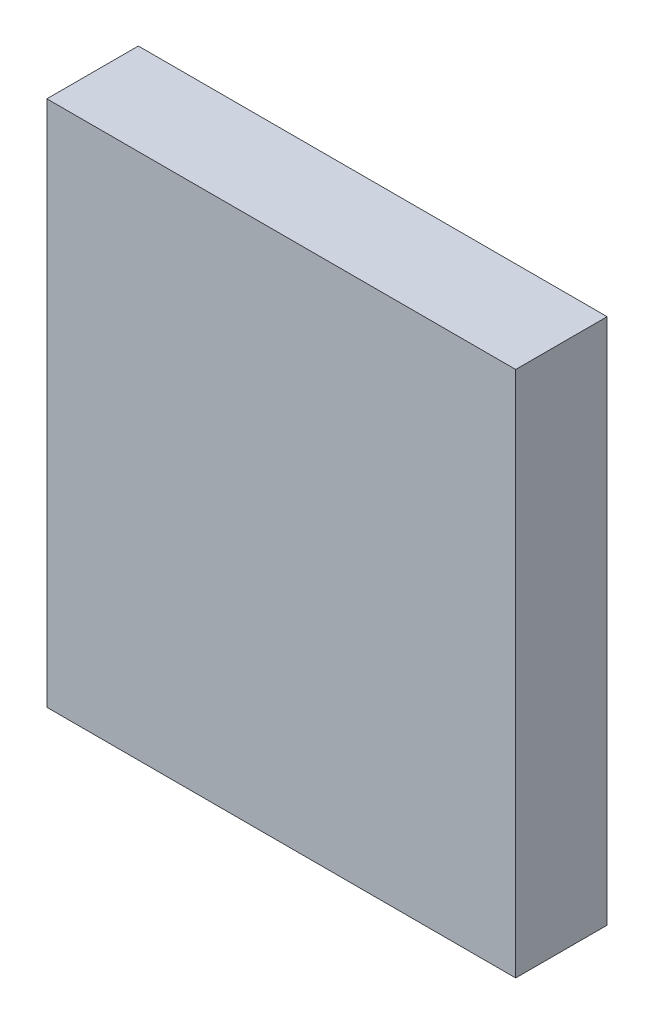
ISO-10303-21;
HEADER;
FILE_DESCRIPTION(('STEP AP214'),'2;1');
FILE_NAME('part.step','',(''),(''),'','','');
FILE_SCHEMA(('AUTOMOTIVE_DESIGN { 1 0 10303 214 1 1 1 1 }'));
ENDSEC;
DATA;
#1=APPLICATION_CONTEXT('core data for automotive mechanical design processes');
#2=APPLICATION_PROTOCOL_DEFINITION('international standard','automotive_design',2000,#1);
#3=PRODUCT_CONTEXT('',#1,'mechanical');
#4=PRODUCT('Part','Part','',(#3));
#5=PRODUCT_RELATED_PRODUCT_CATEGORY('part','',(#4));
#6=PRODUCT_DEFINITION_FORMATION('','',#4);
#7=PRODUCT_DEFINITION_CONTEXT('part definition',#1,'design');
#8=PRODUCT_DEFINITION('design','',#6,#7);
#9=PRODUCT_DEFINITION_SHAPE('','',#8);
#10=(LENGTH_UNIT() NAMED_UNIT(*) SI_UNIT(.MILLI.,.METRE.));
#11=(NAMED_UNIT(*) PLANE_ANGLE_UNIT() SI_UNIT($,.RADIAN.));
#12=(NAMED_UNIT(*) SI_UNIT($,.STERADIAN.) SOLID_ANGLE_UNIT());
#13=UNCERTAINTY_MEASURE_WITH_UNIT(LENGTH_MEASURE(1.E-05),#10,'distance_accuracy_value','');
#14=(GEOMETRIC_REPRESENTATION_CONTEXT(3) GLOBAL_UNCERTAINTY_ASSIGNED_CONTEXT((#13)) GLOBAL_UNIT_ASSIGNED_CONTEXT((#10,
#11,#12)) REPRESENTATION_CONTEXT('',''));
#15=CARTESIAN_POINT('',(0.,0.,0.));
#16=DIRECTION('',(0.,0.,1.));
#17=DIRECTION('',(1.,0.,0.));
#18=AXIS2_PLACEMENT_3D('',#15,#16,#17);
#19=CARTESIAN_POINT('',(-2.5635,-2.5635,1.));
#20=DIRECTION('',(1.,0.,0.));
#21=DIRECTION('',(0.,0.,-1.));
#22=AXIS2_PLACEMENT_3D('',#19,#20,#21);
#23=PLANE('',#22);
#24=DIRECTION('',(0.,-1.,0.));
#25=VECTOR('',#24,1.);
#26=CARTESIAN_POINT('',(-2.5635,-2.5635,0.));
#27=LINE('',#26,#25);
#28=CARTESIAN_POINT('',(-2.5635,3.2,0.));
#29=VERTEX_POINT('',#28);
#30=CARTESIAN_POINT('',(-2.5635,-2.5635,0.));
#31=VERTEX_POINT('',#30);
#32=EDGE_CURVE('E116',#29,#31,#27,.T.);
#33=ORIENTED_EDGE('',*,*,#32,.T.);
#34=DIRECTION('',(0.,0.,-1.));
#35=VECTOR('',#34,1.);
#36=CARTESIAN_POINT('',(-2.5635,-2.5635,1.));
#37=LINE('',#36,#35);
#38=CARTESIAN_POINT('',(-2.5635,-2.5635,1.));
#39=VERTEX_POINT('',#38);
#40=EDGE_CURVE('E11',#39,#31,#37,.T.);
#41=ORIENTED_EDGE('',*,*,#40,.F.);
#42=DIRECTION('',(0.,-1.,0.));
#43=VECTOR('',#42,1.);
#44=CARTESIAN_POINT('',(-2.5635,-2.5635,1.));
#45=LINE('',#44,#43);
#46=CARTESIAN_POINT('',(-2.5635,3.2,1.));
#47=VERTEX_POINT('',#46);
#48=EDGE_CURVE('E98',#47,#39,#45,.T.);
#49=ORIENTED_EDGE('',*,*,#48,.F.);
#50=DIRECTION('',(0.,0.,-1.));
#51=VECTOR('',#50,1.);
#52=CARTESIAN_POINT('',(-2.5635,3.2,1.));
#53=LINE('',#52,#51);
#54=EDGE_CURVE('E112',#47,#29,#53,.T.);
#55=ORIENTED_EDGE('',*,*,#54,.T.);
#56=EDGE_LOOP('',(#33,#41,#49,#55));
#57=FACE_BOUND('',#56,.T.);
#58=ADVANCED_FACE('F38',(#57),#23,.F.);
#59=CARTESIAN_POINT('',(2.5635,-2.5635,1.));
#60=DIRECTION('',(0.,1.,0.));
#61=DIRECTION('',(0.,0.,1.));
#62=AXIS2_PLACEMENT_3D('',#59,#60,#61);
#63=PLANE('',#62);
#64=DIRECTION('',(1.,0.,0.));
#65=VECTOR('',#64,1.);
#66=CARTESIAN_POINT('',(2.5635,-2.5635,0.));
#67=LINE('',#66,#65);
#68=CARTESIAN_POINT('',(2.5635,-2.5635,0.));
#69=VERTEX_POINT('',#68);
#70=EDGE_CURVE('E103',#31,#69,#67,.T.);
#71=ORIENTED_EDGE('',*,*,#70,.T.);
#72=DIRECTION('',(0.,0.,-1.));
#73=VECTOR('',#72,1.);
#74=CARTESIAN_POINT('',(2.5635,-2.5635,1.));
#75=LINE('',#74,#73);
#76=CARTESIAN_POINT('',(2.5635,-2.5635,1.));
#77=VERTEX_POINT('',#76);
#78=EDGE_CURVE('E47',#77,#69,#75,.T.);
#79=ORIENTED_EDGE('',*,*,#78,.F.);
#80=DIRECTION('',(1.,0.,0.));
#81=VECTOR('',#80,1.);
#82=CARTESIAN_POINT('',(2.5635,-2.5635,1.));
#83=LINE('',#82,#81);
#84=EDGE_CURVE('E93',#39,#77,#83,.T.);
#85=ORIENTED_EDGE('',*,*,#84,.F.);
#86=ORIENTED_EDGE('',*,*,#40,.T.);
#87=EDGE_LOOP('',(#71,#79,#85,#86));
#88=FACE_BOUND('',#87,.T.);
#89=ADVANCED_FACE('F102',(#88),#63,.F.);
#90=CARTESIAN_POINT('',(2.5635,3.2,1.));
#91=DIRECTION('',(-1.,0.,0.));
#92=DIRECTION('',(0.,0.,1.));
#93=AXIS2_PLACEMENT_3D('',#90,#91,#92);
#94=PLANE('',#93);
#95=DIRECTION('',(0.,1.,0.));
#96=VECTOR('',#95,1.);
#97=CARTESIAN_POINT('',(2.5635,3.2,0.));
#98=LINE('',#97,#96);
#99=CARTESIAN_POINT('',(2.5635,3.2,0.));
#100=VERTEX_POINT('',#99);
#101=EDGE_CURVE('E79',#69,#100,#98,.T.);
#102=ORIENTED_EDGE('',*,*,#101,.T.);
#103=DIRECTION('',(0.,0.,-1.));
#104=VECTOR('',#103,1.);
#105=CARTESIAN_POINT('',(2.5635,3.2,1.));
#106=LINE('',#105,#104);
#107=CARTESIAN_POINT('',(2.5635,3.2,1.));
#108=VERTEX_POINT('',#107);
#109=EDGE_CURVE('E105',#108,#100,#106,.T.);
#110=ORIENTED_EDGE('',*,*,#109,.F.);
#111=DIRECTION('',(0.,1.,0.));
#112=VECTOR('',#111,1.);
#113=CARTESIAN_POINT('',(2.5635,3.2,1.));
#114=LINE('',#113,#112);
#115=EDGE_CURVE('E96',#77,#108,#114,.T.);
#116=ORIENTED_EDGE('',*,*,#115,.F.);
#117=ORIENTED_EDGE('',*,*,#78,.T.);
#118=EDGE_LOOP('',(#102,#110,#116,#117));
#119=FACE_BOUND('',#118,.T.);
#120=ADVANCED_FACE('F106',(#119),#94,.F.);
#121=CARTESIAN_POINT('',(-2.5635,3.2,1.));
#122=DIRECTION('',(0.,-1.,0.));
#123=DIRECTION('',(0.,0.,-1.));
#124=AXIS2_PLACEMENT_3D('',#121,#122,#123);
#125=PLANE('',#124);
#126=DIRECTION('',(-1.,0.,0.));
#127=VECTOR('',#126,1.);
#128=CARTESIAN_POINT('',(-2.5635,3.2,0.));
#129=LINE('',#128,#127);
#130=EDGE_CURVE('E85',#100,#29,#129,.T.);
#131=ORIENTED_EDGE('',*,*,#130,.T.);
#132=ORIENTED_EDGE('',*,*,#54,.F.);
#133=DIRECTION('',(-1.,0.,0.));
#134=VECTOR('',#133,1.);
#135=CARTESIAN_POINT('',(-2.5635,3.2,1.));
#136=LINE('',#135,#134);
#137=EDGE_CURVE('E57',#108,#47,#136,.T.);
#138=ORIENTED_EDGE('',*,*,#137,.F.);
#139=ORIENTED_EDGE('',*,*,#109,.T.);
#140=EDGE_LOOP('',(#131,#132,#138,#139));
#141=FACE_BOUND('',#140,.T.);
#142=ADVANCED_FACE('F127',(#141),#125,.F.);
#143=CARTESIAN_POINT('',(0.,0.,1.));
#144=DIRECTION('',(0.,0.,-1.));
#145=DIRECTION('',(-1.,0.,0.));
#146=AXIS2_PLACEMENT_3D('',#143,#144,#145);
#147=PLANE('',#146);
#148=ORIENTED_EDGE('',*,*,#48,.T.);
#149=ORIENTED_EDGE('',*,*,#84,.T.);
#150=ORIENTED_EDGE('',*,*,#115,.T.);
#151=ORIENTED_EDGE('',*,*,#137,.T.);
#152=EDGE_LOOP('',(#148,#149,#150,#151));
#153=FACE_BOUND('',#152,.T.);
#154=ADVANCED_FACE('F94',(#153),#147,.F.);
#155=CARTESIAN_POINT('',(0.,0.,0.));
#156=DIRECTION('',(0.,0.,-1.));
#157=DIRECTION('',(-1.,0.,0.));
#158=AXIS2_PLACEMENT_3D('',#155,#156,#157);
#159=PLANE('',#158);
#160=ORIENTED_EDGE('',*,*,#32,.F.);
#161=ORIENTED_EDGE('',*,*,#130,.F.);
#162=ORIENTED_EDGE('',*,*,#101,.F.);
#163=ORIENTED_EDGE('',*,*,#70,.F.);
#164=EDGE_LOOP('',(#160,#161,#162,#163));
#165=FACE_BOUND('',#164,.T.);
#166=ADVANCED_FACE('F130',(#165),#159,.T.);
#167=CLOSED_SHELL('',(#58,#89,#120,#142,#154,#166));
#168=MANIFOLD_SOLID_BREP('B2',#167);
#169=ADVANCED_BREP_SHAPE_REPRESENTATION('',(#18,#168),#14);
#170=SHAPE_DEFINITION_REPRESENTATION(#9,#169);
ENDSEC;
END-ISO-10303-21;
